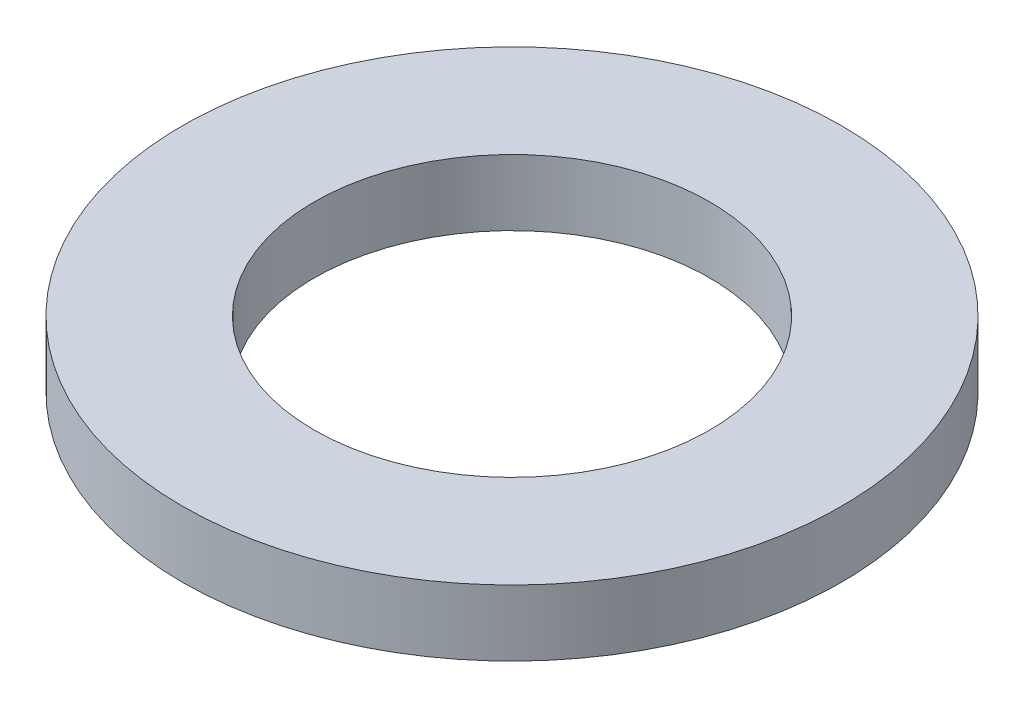
ISO-10303-21;
HEADER;
FILE_DESCRIPTION(('STEP AP214'),'2;1');
FILE_NAME('part.step','',(''),(''),'','','');
FILE_SCHEMA(('AUTOMOTIVE_DESIGN { 1 0 10303 214 1 1 1 1 }'));
ENDSEC;
DATA;
#1=APPLICATION_CONTEXT('core data for automotive mechanical design processes');
#2=APPLICATION_PROTOCOL_DEFINITION('international standard','automotive_design',2000,#1);
#3=PRODUCT_CONTEXT('',#1,'mechanical');
#4=PRODUCT('Part','Part','',(#3));
#5=PRODUCT_RELATED_PRODUCT_CATEGORY('part','',(#4));
#6=PRODUCT_DEFINITION_FORMATION('','',#4);
#7=PRODUCT_DEFINITION_CONTEXT('part definition',#1,'design');
#8=PRODUCT_DEFINITION('design','',#6,#7);
#9=PRODUCT_DEFINITION_SHAPE('','',#8);
#10=(LENGTH_UNIT() NAMED_UNIT(*) SI_UNIT(.MILLI.,.METRE.));
#11=(NAMED_UNIT(*) PLANE_ANGLE_UNIT() SI_UNIT($,.RADIAN.));
#12=(NAMED_UNIT(*) SI_UNIT($,.STERADIAN.) SOLID_ANGLE_UNIT());
#13=UNCERTAINTY_MEASURE_WITH_UNIT(LENGTH_MEASURE(1.E-05),#10,'distance_accuracy_value','');
#14=(GEOMETRIC_REPRESENTATION_CONTEXT(3) GLOBAL_UNCERTAINTY_ASSIGNED_CONTEXT((#13)) GLOBAL_UNIT_ASSIGNED_CONTEXT((#10,
#11,#12)) REPRESENTATION_CONTEXT('',''));
#15=CARTESIAN_POINT('',(0.,0.,0.));
#16=DIRECTION('',(0.,0.,1.));
#17=DIRECTION('',(1.,0.,0.));
#18=AXIS2_PLACEMENT_3D('',#15,#16,#17);
#19=CARTESIAN_POINT('',(0.,2.,0.));
#20=DIRECTION('',(0.,1.,0.));
#21=DIRECTION('',(0.,0.,1.));
#22=AXIS2_PLACEMENT_3D('',#19,#20,#21);
#23=PLANE('',#22);
#24=CARTESIAN_POINT('',(0.,2.,0.));
#25=DIRECTION('',(0.,1.,0.));
#26=DIRECTION('',(0.,0.,1.));
#27=AXIS2_PLACEMENT_3D('',#24,#25,#26);
#28=CIRCLE('',#27,10.);
#29=CARTESIAN_POINT('',(0.,2.,10.));
#30=VERTEX_POINT('',#29);
#31=EDGE_CURVE('E10',#30,#30,#28,.T.);
#32=ORIENTED_EDGE('',*,*,#31,.T.);
#33=EDGE_LOOP('',(#32));
#34=FACE_BOUND('',#33,.T.);
#35=CARTESIAN_POINT('',(0.,2.,0.));
#36=DIRECTION('',(0.,1.,0.));
#37=DIRECTION('',(0.,0.,1.));
#38=AXIS2_PLACEMENT_3D('',#35,#36,#37);
#39=CIRCLE('',#38,6.);
#40=CARTESIAN_POINT('',(0.,2.,6.));
#41=VERTEX_POINT('',#40);
#42=EDGE_CURVE('E56',#41,#41,#39,.T.);
#43=ORIENTED_EDGE('',*,*,#42,.F.);
#44=EDGE_LOOP('',(#43));
#45=FACE_BOUND('',#44,.T.);
#46=ADVANCED_FACE('F43',(#34,#45),#23,.T.);
#47=CARTESIAN_POINT('',(0.,0.,0.));
#48=DIRECTION('',(0.,1.,0.));
#49=DIRECTION('',(0.,0.,1.));
#50=AXIS2_PLACEMENT_3D('',#47,#48,#49);
#51=PLANE('',#50);
#52=CARTESIAN_POINT('',(0.,0.,0.));
#53=DIRECTION('',(0.,1.,0.));
#54=DIRECTION('',(0.,0.,1.));
#55=AXIS2_PLACEMENT_3D('',#52,#53,#54);
#56=CIRCLE('',#55,10.);
#57=CARTESIAN_POINT('',(0.,0.,10.));
#58=VERTEX_POINT('',#57);
#59=EDGE_CURVE('E47',#58,#58,#56,.T.);
#60=ORIENTED_EDGE('',*,*,#59,.F.);
#61=EDGE_LOOP('',(#60));
#62=FACE_BOUND('',#61,.T.);
#63=CARTESIAN_POINT('',(0.,0.,0.));
#64=DIRECTION('',(0.,1.,0.));
#65=DIRECTION('',(0.,0.,1.));
#66=AXIS2_PLACEMENT_3D('',#63,#64,#65);
#67=CIRCLE('',#66,6.);
#68=CARTESIAN_POINT('',(0.,0.,6.));
#69=VERTEX_POINT('',#68);
#70=EDGE_CURVE('E58',#69,#69,#67,.T.);
#71=ORIENTED_EDGE('',*,*,#70,.T.);
#72=EDGE_LOOP('',(#71));
#73=FACE_BOUND('',#72,.T.);
#74=ADVANCED_FACE('F70',(#62,#73),#51,.F.);
#75=CARTESIAN_POINT('',(0.,2.,0.));
#76=DIRECTION('',(0.,-1.,0.));
#77=DIRECTION('',(0.,0.,-1.));
#78=AXIS2_PLACEMENT_3D('',#75,#76,#77);
#79=CYLINDRICAL_SURFACE('',#78,10.);
#80=ORIENTED_EDGE('',*,*,#31,.F.);
#81=EDGE_LOOP('',(#80));
#82=FACE_BOUND('',#81,.T.);
#83=ORIENTED_EDGE('',*,*,#59,.T.);
#84=EDGE_LOOP('',(#83));
#85=FACE_BOUND('',#84,.T.);
#86=ADVANCED_FACE('F45',(#82,#85),#79,.T.);
#87=CARTESIAN_POINT('',(0.,2.,0.));
#88=DIRECTION('',(0.,-1.,0.));
#89=DIRECTION('',(0.,0.,-1.));
#90=AXIS2_PLACEMENT_3D('',#87,#88,#89);
#91=CYLINDRICAL_SURFACE('',#90,6.);
#92=ORIENTED_EDGE('',*,*,#42,.T.);
#93=EDGE_LOOP('',(#92));
#94=FACE_BOUND('',#93,.T.);
#95=ORIENTED_EDGE('',*,*,#70,.F.);
#96=EDGE_LOOP('',(#95));
#97=FACE_BOUND('',#96,.T.);
#98=ADVANCED_FACE('F66',(#94,#97),#91,.F.);
#99=CLOSED_SHELL('',(#46,#74,#86,#98));
#100=MANIFOLD_SOLID_BREP('B2',#99);
#101=ADVANCED_BREP_SHAPE_REPRESENTATION('',(#18,#100),#14);
#102=SHAPE_DEFINITION_REPRESENTATION(#9,#101);
ENDSEC;
END-ISO-10303-21;
